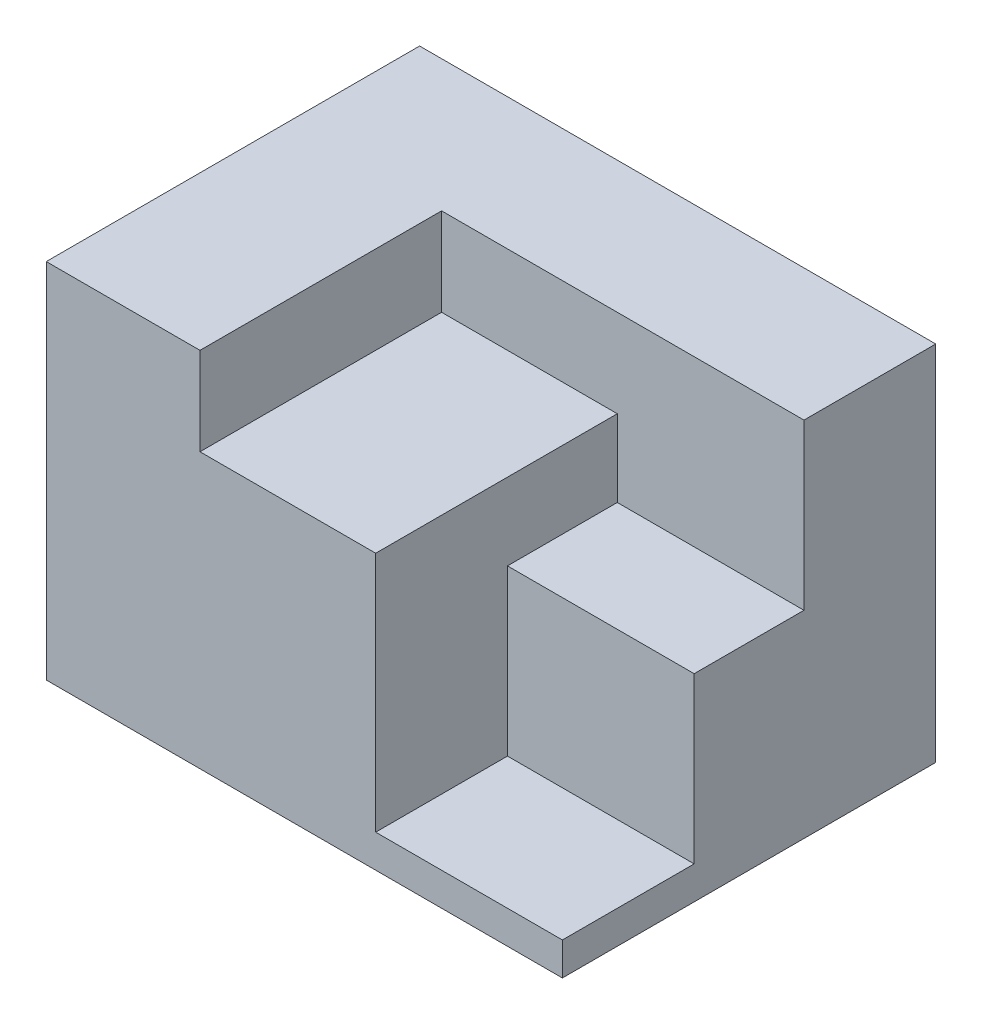
ISO-10303-21;
HEADER;
FILE_DESCRIPTION(('STEP AP214'),'2;1');
FILE_NAME('part.step','',(''),(''),'','','');
FILE_SCHEMA(('AUTOMOTIVE_DESIGN { 1 0 10303 214 1 1 1 1 }'));
ENDSEC;
DATA;
#1=APPLICATION_CONTEXT('core data for automotive mechanical design processes');
#2=APPLICATION_PROTOCOL_DEFINITION('international standard','automotive_design',2000,#1);
#3=PRODUCT_CONTEXT('',#1,'mechanical');
#4=PRODUCT('Part','Part','',(#3));
#5=PRODUCT_RELATED_PRODUCT_CATEGORY('part','',(#4));
#6=PRODUCT_DEFINITION_FORMATION('','',#4);
#7=PRODUCT_DEFINITION_CONTEXT('part definition',#1,'design');
#8=PRODUCT_DEFINITION('design','',#6,#7);
#9=PRODUCT_DEFINITION_SHAPE('','',#8);
#10=(LENGTH_UNIT() NAMED_UNIT(*) SI_UNIT(.MILLI.,.METRE.));
#11=(NAMED_UNIT(*) PLANE_ANGLE_UNIT() SI_UNIT($,.RADIAN.));
#12=(NAMED_UNIT(*) SI_UNIT($,.STERADIAN.) SOLID_ANGLE_UNIT());
#13=UNCERTAINTY_MEASURE_WITH_UNIT(LENGTH_MEASURE(1.E-05),#10,'distance_accuracy_value','');
#14=(GEOMETRIC_REPRESENTATION_CONTEXT(3) GLOBAL_UNCERTAINTY_ASSIGNED_CONTEXT((#13)) GLOBAL_UNIT_ASSIGNED_CONTEXT((#10,
#11,#12)) REPRESENTATION_CONTEXT('',''));
#15=CARTESIAN_POINT('',(0.,0.,0.));
#16=DIRECTION('',(0.,0.,1.));
#17=DIRECTION('',(1.,0.,0.));
#18=AXIS2_PLACEMENT_3D('',#15,#16,#17);
#19=CARTESIAN_POINT('',(-6.81855787043715,9.69718086640016,12.));
#20=DIRECTION('',(0.,-1.,0.));
#21=DIRECTION('',(1.,0.,0.));
#22=AXIS2_PLACEMENT_3D('',#19,#20,#21);
#23=PLANE('',#22);
#24=DIRECTION('',(0.,0.,1.));
#25=VECTOR('',#24,1.);
#26=CARTESIAN_POINT('',(9.18144212956285,9.69718086640016,0.));
#27=LINE('',#26,#25);
#28=CARTESIAN_POINT('',(9.18144212956285,9.69718086640016,12.));
#29=VERTEX_POINT('',#28);
#30=CARTESIAN_POINT('',(9.18144212956285,9.69718086640016,34.));
#31=VERTEX_POINT('',#30);
#32=EDGE_CURVE('E155',#29,#31,#27,.T.);
#33=ORIENTED_EDGE('',*,*,#32,.F.);
#34=DIRECTION('',(1.,0.,0.));
#35=VECTOR('',#34,1.);
#36=CARTESIAN_POINT('',(-6.81855787043715,9.69718086640016,12.));
#37=LINE('',#36,#35);
#38=CARTESIAN_POINT('',(-6.81855787043715,9.69718086640016,12.));
#39=VERTEX_POINT('',#38);
#40=EDGE_CURVE('E170',#39,#29,#37,.T.);
#41=ORIENTED_EDGE('',*,*,#40,.F.);
#42=DIRECTION('',(0.,0.,1.));
#43=VECTOR('',#42,1.);
#44=CARTESIAN_POINT('',(-6.81855787043715,9.69718086640016,12.));
#45=LINE('',#44,#43);
#46=CARTESIAN_POINT('',(-6.81855787043715,9.69718086640016,34.));
#47=VERTEX_POINT('',#46);
#48=EDGE_CURVE('E179',#39,#47,#45,.T.);
#49=ORIENTED_EDGE('',*,*,#48,.T.);
#50=DIRECTION('',(1.,0.,0.));
#51=VECTOR('',#50,1.);
#52=CARTESIAN_POINT('',(-6.81855787043715,9.69718086640016,34.));
#53=LINE('',#52,#51);
#54=EDGE_CURVE('E171',#47,#31,#53,.T.);
#55=ORIENTED_EDGE('',*,*,#54,.T.);
#56=EDGE_LOOP('',(#33,#41,#49,#55));
#57=FACE_BOUND('',#56,.T.);
#58=ADVANCED_FACE('F33',(#57),#23,.F.);
#59=CARTESIAN_POINT('',(-20.8185578704371,17.6971808664002,34.));
#60=DIRECTION('',(1.,0.,0.));
#61=DIRECTION('',(0.,1.,0.));
#62=AXIS2_PLACEMENT_3D('',#59,#60,#61);
#63=PLANE('',#62);
#64=DIRECTION('',(0.,-1.,0.));
#65=VECTOR('',#64,1.);
#66=CARTESIAN_POINT('',(-20.8185578704371,17.6971808664002,0.));
#67=LINE('',#66,#65);
#68=CARTESIAN_POINT('',(-20.8185578704371,17.6971808664002,0.));
#69=VERTEX_POINT('',#68);
#70=CARTESIAN_POINT('',(-20.8185578704371,-15.3028191335998,0.));
#71=VERTEX_POINT('',#70);
#72=EDGE_CURVE('E185',#69,#71,#67,.T.);
#73=ORIENTED_EDGE('',*,*,#72,.T.);
#74=DIRECTION('',(0.,0.,-1.));
#75=VECTOR('',#74,1.);
#76=CARTESIAN_POINT('',(-20.8185578704371,-15.3028191335998,34.));
#77=LINE('',#76,#75);
#78=CARTESIAN_POINT('',(-20.8185578704371,-15.3028191335998,34.));
#79=VERTEX_POINT('',#78);
#80=EDGE_CURVE('E11',#79,#71,#77,.T.);
#81=ORIENTED_EDGE('',*,*,#80,.F.);
#82=DIRECTION('',(0.,-1.,0.));
#83=VECTOR('',#82,1.);
#84=CARTESIAN_POINT('',(-20.8185578704371,17.6971808664002,34.));
#85=LINE('',#84,#83);
#86=CARTESIAN_POINT('',(-20.8185578704371,17.6971808664002,34.));
#87=VERTEX_POINT('',#86);
#88=EDGE_CURVE('E187',#87,#79,#85,.T.);
#89=ORIENTED_EDGE('',*,*,#88,.F.);
#90=DIRECTION('',(0.,0.,-1.));
#91=VECTOR('',#90,1.);
#92=CARTESIAN_POINT('',(-20.8185578704371,17.6971808664002,34.));
#93=LINE('',#92,#91);
#94=EDGE_CURVE('E194',#87,#69,#93,.T.);
#95=ORIENTED_EDGE('',*,*,#94,.T.);
#96=EDGE_LOOP('',(#73,#81,#89,#95));
#97=FACE_BOUND('',#96,.T.);
#98=ADVANCED_FACE('F35',(#97),#63,.F.);
#99=CARTESIAN_POINT('',(-20.8185578704371,-15.3028191335998,34.));
#100=DIRECTION('',(0.,1.,0.));
#101=DIRECTION('',(0.,0.,1.));
#102=AXIS2_PLACEMENT_3D('',#99,#100,#101);
#103=PLANE('',#102);
#104=DIRECTION('',(1.,0.,0.));
#105=VECTOR('',#104,1.);
#106=CARTESIAN_POINT('',(-20.8185578704371,-15.3028191335998,0.));
#107=LINE('',#106,#105);
#108=CARTESIAN_POINT('',(26.1814421295629,-15.3028191335998,0.));
#109=VERTEX_POINT('',#108);
#110=EDGE_CURVE('E197',#71,#109,#107,.T.);
#111=ORIENTED_EDGE('',*,*,#110,.T.);
#112=DIRECTION('',(0.,0.,-1.));
#113=VECTOR('',#112,1.);
#114=CARTESIAN_POINT('',(26.1814421295629,-15.3028191335998,34.));
#115=LINE('',#114,#113);
#116=CARTESIAN_POINT('',(26.1814421295629,-15.3028191335998,34.));
#117=VERTEX_POINT('',#116);
#118=EDGE_CURVE('E41',#117,#109,#115,.T.);
#119=ORIENTED_EDGE('',*,*,#118,.F.);
#120=DIRECTION('',(1.,0.,0.));
#121=VECTOR('',#120,1.);
#122=CARTESIAN_POINT('',(-20.8185578704371,-15.3028191335998,34.));
#123=LINE('',#122,#121);
#124=EDGE_CURVE('E81',#79,#117,#123,.T.);
#125=ORIENTED_EDGE('',*,*,#124,.F.);
#126=ORIENTED_EDGE('',*,*,#80,.T.);
#127=EDGE_LOOP('',(#111,#119,#125,#126));
#128=FACE_BOUND('',#127,.T.);
#129=ADVANCED_FACE('F247',(#128),#103,.F.);
#130=CARTESIAN_POINT('',(26.1814421295629,17.6971808664002,34.));
#131=DIRECTION('',(-1.,0.,0.));
#132=DIRECTION('',(0.,-1.,0.));
#133=AXIS2_PLACEMENT_3D('',#130,#131,#132);
#134=PLANE('',#133);
#135=DIRECTION('',(0.,-1.,0.));
#136=VECTOR('',#135,1.);
#137=CARTESIAN_POINT('',(26.1814421295629,0.,22.));
#138=LINE('',#137,#136);
#139=CARTESIAN_POINT('',(26.1814421295629,2.69718086640016,22.));
#140=VERTEX_POINT('',#139);
#141=CARTESIAN_POINT('',(26.1814421295629,-12.3028191335998,22.));
#142=VERTEX_POINT('',#141);
#143=EDGE_CURVE('E141',#140,#142,#138,.T.);
#144=ORIENTED_EDGE('',*,*,#143,.T.);
#145=DIRECTION('',(0.,0.,-1.));
#146=VECTOR('',#145,1.);
#147=CARTESIAN_POINT('',(26.1814421295629,-12.3028191335998,0.));
#148=LINE('',#147,#146);
#149=CARTESIAN_POINT('',(26.1814421295629,-12.3028191335998,34.));
#150=VERTEX_POINT('',#149);
#151=EDGE_CURVE('E148',#150,#142,#148,.T.);
#152=ORIENTED_EDGE('',*,*,#151,.F.);
#153=DIRECTION('',(0.,1.,0.));
#154=VECTOR('',#153,1.);
#155=CARTESIAN_POINT('',(26.1814421295629,17.6971808664002,34.));
#156=LINE('',#155,#154);
#157=EDGE_CURVE('E190',#117,#150,#156,.T.);
#158=ORIENTED_EDGE('',*,*,#157,.F.);
#159=ORIENTED_EDGE('',*,*,#118,.T.);
#160=DIRECTION('',(0.,1.,0.));
#161=VECTOR('',#160,1.);
#162=CARTESIAN_POINT('',(26.1814421295629,17.6971808664002,0.));
#163=LINE('',#162,#161);
#164=CARTESIAN_POINT('',(26.1814421295629,17.6971808664002,0.));
#165=VERTEX_POINT('',#164);
#166=EDGE_CURVE('E199',#109,#165,#163,.T.);
#167=ORIENTED_EDGE('',*,*,#166,.T.);
#168=DIRECTION('',(0.,0.,-1.));
#169=VECTOR('',#168,1.);
#170=CARTESIAN_POINT('',(26.1814421295629,17.6971808664002,34.));
#171=LINE('',#170,#169);
#172=CARTESIAN_POINT('',(26.1814421295629,17.6971808664002,12.));
#173=VERTEX_POINT('',#172);
#174=EDGE_CURVE('E204',#173,#165,#171,.T.);
#175=ORIENTED_EDGE('',*,*,#174,.F.);
#176=DIRECTION('',(0.,1.,0.));
#177=VECTOR('',#176,1.);
#178=CARTESIAN_POINT('',(26.1814421295629,17.6971808664002,12.));
#179=LINE('',#178,#177);
#180=CARTESIAN_POINT('',(26.1814421295629,2.69718086640016,12.));
#181=VERTEX_POINT('',#180);
#182=EDGE_CURVE('E174',#181,#173,#179,.T.);
#183=ORIENTED_EDGE('',*,*,#182,.F.);
#184=DIRECTION('',(0.,0.,1.));
#185=VECTOR('',#184,1.);
#186=CARTESIAN_POINT('',(26.1814421295629,2.69718086640016,0.));
#187=LINE('',#186,#185);
#188=EDGE_CURVE('E151',#181,#140,#187,.T.);
#189=ORIENTED_EDGE('',*,*,#188,.T.);
#190=EDGE_LOOP('',(#144,#152,#158,#159,#167,#175,#183,#189));
#191=FACE_BOUND('',#190,.T.);
#192=ADVANCED_FACE('F209',(#191),#134,.F.);
#193=CARTESIAN_POINT('',(-20.8185578704371,17.6971808664002,34.));
#194=DIRECTION('',(0.,-1.,0.));
#195=DIRECTION('',(0.,0.,-1.));
#196=AXIS2_PLACEMENT_3D('',#193,#194,#195);
#197=PLANE('',#196);
#198=DIRECTION('',(-1.,0.,0.));
#199=VECTOR('',#198,1.);
#200=CARTESIAN_POINT('',(-20.8185578704371,17.6971808664002,34.));
#201=LINE('',#200,#199);
#202=CARTESIAN_POINT('',(-6.81855787043715,17.6971808664002,34.));
#203=VERTEX_POINT('',#202);
#204=EDGE_CURVE('E56',#203,#87,#201,.T.);
#205=ORIENTED_EDGE('',*,*,#204,.F.);
#206=DIRECTION('',(0.,0.,1.));
#207=VECTOR('',#206,1.);
#208=CARTESIAN_POINT('',(-6.81855787043715,17.6971808664002,12.));
#209=LINE('',#208,#207);
#210=CARTESIAN_POINT('',(-6.81855787043715,17.6971808664002,12.));
#211=VERTEX_POINT('',#210);
#212=EDGE_CURVE('E183',#211,#203,#209,.T.);
#213=ORIENTED_EDGE('',*,*,#212,.F.);
#214=DIRECTION('',(-1.,0.,0.));
#215=VECTOR('',#214,1.);
#216=CARTESIAN_POINT('',(-6.81855787043715,17.6971808664002,12.));
#217=LINE('',#216,#215);
#218=EDGE_CURVE('E176',#173,#211,#217,.T.);
#219=ORIENTED_EDGE('',*,*,#218,.F.);
#220=ORIENTED_EDGE('',*,*,#174,.T.);
#221=DIRECTION('',(-1.,0.,0.));
#222=VECTOR('',#221,1.);
#223=CARTESIAN_POINT('',(-20.8185578704371,17.6971808664002,0.));
#224=LINE('',#223,#222);
#225=EDGE_CURVE('E76',#165,#69,#224,.T.);
#226=ORIENTED_EDGE('',*,*,#225,.T.);
#227=ORIENTED_EDGE('',*,*,#94,.F.);
#228=EDGE_LOOP('',(#205,#213,#219,#220,#226,#227));
#229=FACE_BOUND('',#228,.T.);
#230=ADVANCED_FACE('F218',(#229),#197,.F.);
#231=CARTESIAN_POINT('',(0.,0.,34.));
#232=DIRECTION('',(0.,0.,1.));
#233=DIRECTION('',(1.,0.,0.));
#234=AXIS2_PLACEMENT_3D('',#231,#232,#233);
#235=PLANE('',#234);
#236=DIRECTION('',(1.,0.,0.));
#237=VECTOR('',#236,1.);
#238=CARTESIAN_POINT('',(9.18144212956286,-12.3028191335998,34.));
#239=LINE('',#238,#237);
#240=CARTESIAN_POINT('',(9.18144212956286,-12.3028191335998,34.));
#241=VERTEX_POINT('',#240);
#242=EDGE_CURVE('E164',#241,#150,#239,.T.);
#243=ORIENTED_EDGE('',*,*,#242,.F.);
#244=DIRECTION('',(0.,-1.,0.));
#245=VECTOR('',#244,1.);
#246=CARTESIAN_POINT('',(9.18144212956286,0.,34.));
#247=LINE('',#246,#245);
#248=EDGE_CURVE('E157',#31,#241,#247,.T.);
#249=ORIENTED_EDGE('',*,*,#248,.F.);
#250=ORIENTED_EDGE('',*,*,#54,.F.);
#251=DIRECTION('',(0.,-1.,0.));
#252=VECTOR('',#251,1.);
#253=CARTESIAN_POINT('',(-6.81855787043715,17.6971808664002,34.));
#254=LINE('',#253,#252);
#255=EDGE_CURVE('E48',#203,#47,#254,.T.);
#256=ORIENTED_EDGE('',*,*,#255,.F.);
#257=ORIENTED_EDGE('',*,*,#204,.T.);
#258=ORIENTED_EDGE('',*,*,#88,.T.);
#259=ORIENTED_EDGE('',*,*,#124,.T.);
#260=ORIENTED_EDGE('',*,*,#157,.T.);
#261=EDGE_LOOP('',(#243,#249,#250,#256,#257,#258,#259,#260));
#262=FACE_BOUND('',#261,.T.);
#263=ADVANCED_FACE('F224',(#262),#235,.T.);
#264=CARTESIAN_POINT('',(0.,0.,0.));
#265=DIRECTION('',(0.,0.,1.));
#266=DIRECTION('',(1.,0.,0.));
#267=AXIS2_PLACEMENT_3D('',#264,#265,#266);
#268=PLANE('',#267);
#269=ORIENTED_EDGE('',*,*,#72,.F.);
#270=ORIENTED_EDGE('',*,*,#225,.F.);
#271=ORIENTED_EDGE('',*,*,#166,.F.);
#272=ORIENTED_EDGE('',*,*,#110,.F.);
#273=EDGE_LOOP('',(#269,#270,#271,#272));
#274=FACE_BOUND('',#273,.T.);
#275=ADVANCED_FACE('F214',(#274),#268,.F.);
#276=CARTESIAN_POINT('',(-6.81855787043715,17.6971808664002,12.));
#277=DIRECTION('',(-1.,0.,0.));
#278=DIRECTION('',(0.,-1.,0.));
#279=AXIS2_PLACEMENT_3D('',#276,#277,#278);
#280=PLANE('',#279);
#281=ORIENTED_EDGE('',*,*,#255,.T.);
#282=ORIENTED_EDGE('',*,*,#48,.F.);
#283=DIRECTION('',(0.,-1.,0.));
#284=VECTOR('',#283,1.);
#285=CARTESIAN_POINT('',(-6.81855787043715,17.6971808664002,12.));
#286=LINE('',#285,#284);
#287=EDGE_CURVE('E167',#211,#39,#286,.T.);
#288=ORIENTED_EDGE('',*,*,#287,.F.);
#289=ORIENTED_EDGE('',*,*,#212,.T.);
#290=EDGE_LOOP('',(#281,#282,#288,#289));
#291=FACE_BOUND('',#290,.T.);
#292=ADVANCED_FACE('F221',(#291),#280,.F.);
#293=CARTESIAN_POINT('',(0.,0.,12.));
#294=DIRECTION('',(0.,0.,1.));
#295=DIRECTION('',(1.,0.,0.));
#296=AXIS2_PLACEMENT_3D('',#293,#294,#295);
#297=PLANE('',#296);
#298=ORIENTED_EDGE('',*,*,#287,.T.);
#299=ORIENTED_EDGE('',*,*,#40,.T.);
#300=DIRECTION('',(0.,-1.,0.));
#301=VECTOR('',#300,1.);
#302=CARTESIAN_POINT('',(9.18144212956286,0.,12.));
#303=LINE('',#302,#301);
#304=CARTESIAN_POINT('',(9.18144212956286,2.69718086640016,12.));
#305=VERTEX_POINT('',#304);
#306=EDGE_CURVE('E134',#29,#305,#303,.T.);
#307=ORIENTED_EDGE('',*,*,#306,.T.);
#308=DIRECTION('',(1.,0.,0.));
#309=VECTOR('',#308,1.);
#310=CARTESIAN_POINT('',(9.18144212956286,2.69718086640016,12.));
#311=LINE('',#310,#309);
#312=EDGE_CURVE('E131',#305,#181,#311,.T.);
#313=ORIENTED_EDGE('',*,*,#312,.T.);
#314=ORIENTED_EDGE('',*,*,#182,.T.);
#315=ORIENTED_EDGE('',*,*,#218,.T.);
#316=EDGE_LOOP('',(#298,#299,#307,#313,#314,#315));
#317=FACE_BOUND('',#316,.T.);
#318=ADVANCED_FACE('F230',(#317),#297,.T.);
#319=CARTESIAN_POINT('',(9.18144212956286,0.,22.));
#320=DIRECTION('',(0.,0.,1.));
#321=DIRECTION('',(0.,-1.,0.));
#322=AXIS2_PLACEMENT_3D('',#319,#320,#321);
#323=PLANE('',#322);
#324=ORIENTED_EDGE('',*,*,#143,.F.);
#325=DIRECTION('',(1.,0.,0.));
#326=VECTOR('',#325,1.);
#327=CARTESIAN_POINT('',(9.18144212956286,2.69718086640016,22.));
#328=LINE('',#327,#326);
#329=CARTESIAN_POINT('',(9.18144212956286,2.69718086640016,22.));
#330=VERTEX_POINT('',#329);
#331=EDGE_CURVE('E128',#330,#140,#328,.T.);
#332=ORIENTED_EDGE('',*,*,#331,.F.);
#333=DIRECTION('',(0.,-1.,0.));
#334=VECTOR('',#333,1.);
#335=CARTESIAN_POINT('',(9.18144212956286,0.,22.));
#336=LINE('',#335,#334);
#337=CARTESIAN_POINT('',(9.18144212956286,-12.3028191335998,22.));
#338=VERTEX_POINT('',#337);
#339=EDGE_CURVE('E135',#330,#338,#336,.T.);
#340=ORIENTED_EDGE('',*,*,#339,.T.);
#341=DIRECTION('',(1.,0.,0.));
#342=VECTOR('',#341,1.);
#343=CARTESIAN_POINT('',(9.18144212956286,-12.3028191335998,22.));
#344=LINE('',#343,#342);
#345=EDGE_CURVE('E162',#338,#142,#344,.T.);
#346=ORIENTED_EDGE('',*,*,#345,.T.);
#347=EDGE_LOOP('',(#324,#332,#340,#346));
#348=FACE_BOUND('',#347,.T.);
#349=ADVANCED_FACE('F138',(#348),#323,.T.);
#350=CARTESIAN_POINT('',(9.18144212956286,-12.3028191335998,0.));
#351=DIRECTION('',(0.,-1.,0.));
#352=DIRECTION('',(1.,0.,0.));
#353=AXIS2_PLACEMENT_3D('',#350,#351,#352);
#354=PLANE('',#353);
#355=ORIENTED_EDGE('',*,*,#151,.T.);
#356=ORIENTED_EDGE('',*,*,#345,.F.);
#357=DIRECTION('',(0.,0.,-1.));
#358=VECTOR('',#357,1.);
#359=CARTESIAN_POINT('',(9.18144212956286,-12.3028191335998,0.));
#360=LINE('',#359,#358);
#361=EDGE_CURVE('E143',#241,#338,#360,.T.);
#362=ORIENTED_EDGE('',*,*,#361,.F.);
#363=ORIENTED_EDGE('',*,*,#242,.T.);
#364=EDGE_LOOP('',(#355,#356,#362,#363));
#365=FACE_BOUND('',#364,.T.);
#366=ADVANCED_FACE('F232',(#365),#354,.F.);
#367=CARTESIAN_POINT('',(9.18144212956286,2.69718086640016,0.));
#368=DIRECTION('',(0.,1.,0.));
#369=DIRECTION('',(-1.,0.,0.));
#370=AXIS2_PLACEMENT_3D('',#367,#368,#369);
#371=PLANE('',#370);
#372=ORIENTED_EDGE('',*,*,#188,.F.);
#373=ORIENTED_EDGE('',*,*,#312,.F.);
#374=DIRECTION('',(0.,0.,1.));
#375=VECTOR('',#374,1.);
#376=CARTESIAN_POINT('',(9.18144212956286,2.69718086640016,0.));
#377=LINE('',#376,#375);
#378=EDGE_CURVE('E124',#305,#330,#377,.T.);
#379=ORIENTED_EDGE('',*,*,#378,.T.);
#380=ORIENTED_EDGE('',*,*,#331,.T.);
#381=EDGE_LOOP('',(#372,#373,#379,#380));
#382=FACE_BOUND('',#381,.T.);
#383=ADVANCED_FACE('F127',(#382),#371,.T.);
#384=CARTESIAN_POINT('',(9.18144212956286,0.,0.));
#385=DIRECTION('',(1.,0.,0.));
#386=DIRECTION('',(0.,1.,0.));
#387=AXIS2_PLACEMENT_3D('',#384,#385,#386);
#388=PLANE('',#387);
#389=ORIENTED_EDGE('',*,*,#339,.F.);
#390=ORIENTED_EDGE('',*,*,#378,.F.);
#391=ORIENTED_EDGE('',*,*,#306,.F.);
#392=ORIENTED_EDGE('',*,*,#32,.T.);
#393=ORIENTED_EDGE('',*,*,#248,.T.);
#394=ORIENTED_EDGE('',*,*,#361,.T.);
#395=EDGE_LOOP('',(#389,#390,#391,#392,#393,#394));
#396=FACE_BOUND('',#395,.T.);
#397=ADVANCED_FACE('F146',(#396),#388,.T.);
#398=CLOSED_SHELL('',(#58,#98,#129,#192,#230,#263,#275,#292,#318,#349,#366,#383,#397));
#399=MANIFOLD_SOLID_BREP('B2',#398);
#400=ADVANCED_BREP_SHAPE_REPRESENTATION('',(#18,#399),#14);
#401=SHAPE_DEFINITION_REPRESENTATION(#9,#400);
ENDSEC;
END-ISO-10303-21;
